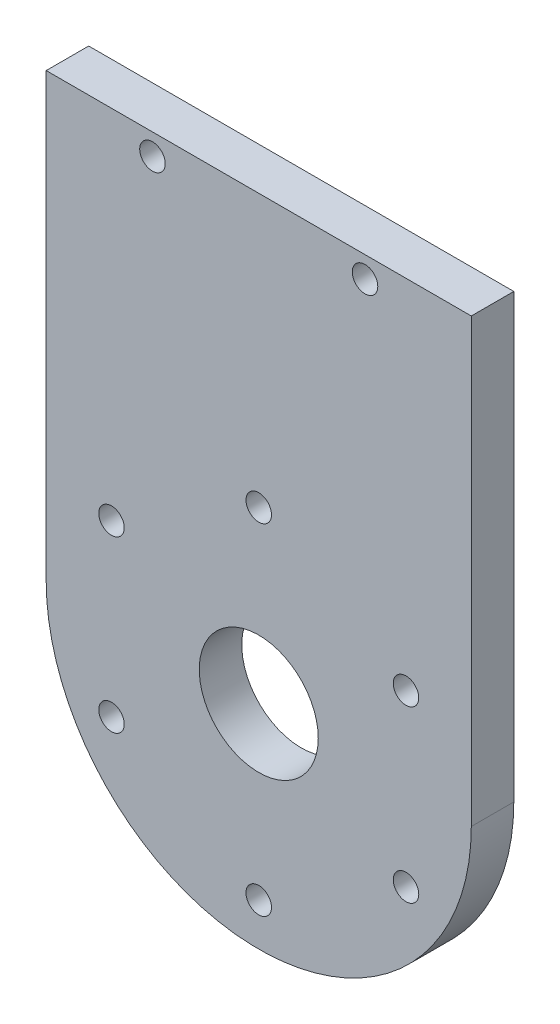
ISO-10303-21;
HEADER;
FILE_DESCRIPTION(('STEP AP214'),'2;1');
FILE_NAME('part.step','',(''),(''),'','','');
FILE_SCHEMA(('AUTOMOTIVE_DESIGN { 1 0 10303 214 1 1 1 1 }'));
ENDSEC;
DATA;
#1=APPLICATION_CONTEXT('core data for automotive mechanical design processes');
#2=APPLICATION_PROTOCOL_DEFINITION('international standard','automotive_design',2000,#1);
#3=PRODUCT_CONTEXT('',#1,'mechanical');
#4=PRODUCT('Part','Part','',(#3));
#5=PRODUCT_RELATED_PRODUCT_CATEGORY('part','',(#4));
#6=PRODUCT_DEFINITION_FORMATION('','',#4);
#7=PRODUCT_DEFINITION_CONTEXT('part definition',#1,'design');
#8=PRODUCT_DEFINITION('design','',#6,#7);
#9=PRODUCT_DEFINITION_SHAPE('','',#8);
#10=(LENGTH_UNIT() NAMED_UNIT(*) SI_UNIT(.MILLI.,.METRE.));
#11=(NAMED_UNIT(*) PLANE_ANGLE_UNIT() SI_UNIT($,.RADIAN.));
#12=(NAMED_UNIT(*) SI_UNIT($,.STERADIAN.) SOLID_ANGLE_UNIT());
#13=UNCERTAINTY_MEASURE_WITH_UNIT(LENGTH_MEASURE(1.E-05),#10,'distance_accuracy_value','');
#14=(GEOMETRIC_REPRESENTATION_CONTEXT(3) GLOBAL_UNCERTAINTY_ASSIGNED_CONTEXT((#13)) GLOBAL_UNIT_ASSIGNED_CONTEXT((#10,
#11,#12)) REPRESENTATION_CONTEXT('',''));
#15=CARTESIAN_POINT('',(0.,0.,0.));
#16=DIRECTION('',(0.,0.,1.));
#17=DIRECTION('',(1.,0.,0.));
#18=AXIS2_PLACEMENT_3D('',#15,#16,#17);
#19=CARTESIAN_POINT('',(0.,52.,5.));
#20=DIRECTION('',(0.,1.,0.));
#21=DIRECTION('',(0.,0.,1.));
#22=AXIS2_PLACEMENT_3D('',#19,#20,#21);
#23=PLANE('',#22);
#24=DIRECTION('',(1.,0.,0.));
#25=VECTOR('',#24,1.);
#26=CARTESIAN_POINT('',(0.,52.,5.));
#27=LINE('',#26,#25);
#28=CARTESIAN_POINT('',(-25.,52.,5.));
#29=VERTEX_POINT('',#28);
#30=CARTESIAN_POINT('',(25.,52.,5.));
#31=VERTEX_POINT('',#30);
#32=EDGE_CURVE('E12',#29,#31,#27,.T.);
#33=ORIENTED_EDGE('',*,*,#32,.T.);
#34=DIRECTION('',(0.,0.,1.));
#35=VECTOR('',#34,1.);
#36=CARTESIAN_POINT('',(25.,52.,0.));
#37=LINE('',#36,#35);
#38=CARTESIAN_POINT('',(25.,52.,0.));
#39=VERTEX_POINT('',#38);
#40=EDGE_CURVE('E341',#39,#31,#37,.T.);
#41=ORIENTED_EDGE('',*,*,#40,.F.);
#42=DIRECTION('',(1.,0.,0.));
#43=VECTOR('',#42,1.);
#44=CARTESIAN_POINT('',(0.,52.,0.));
#45=LINE('',#44,#43);
#46=CARTESIAN_POINT('',(-25.,52.,0.));
#47=VERTEX_POINT('',#46);
#48=EDGE_CURVE('E261',#47,#39,#45,.T.);
#49=ORIENTED_EDGE('',*,*,#48,.F.);
#50=DIRECTION('',(0.,0.,1.));
#51=VECTOR('',#50,1.);
#52=CARTESIAN_POINT('',(-25.,52.,0.));
#53=LINE('',#52,#51);
#54=EDGE_CURVE('E275',#47,#29,#53,.T.);
#55=ORIENTED_EDGE('',*,*,#54,.T.);
#56=EDGE_LOOP('',(#33,#41,#49,#55));
#57=FACE_BOUND('',#56,.T.);
#58=ADVANCED_FACE('F257',(#57),#23,.T.);
#59=CARTESIAN_POINT('',(0.,0.,5.));
#60=DIRECTION('',(0.,0.,1.));
#61=DIRECTION('',(1.,0.,0.));
#62=AXIS2_PLACEMENT_3D('',#59,#60,#61);
#63=PLANE('',#62);
#64=CARTESIAN_POINT('',(17.3205080756901,-9.99999999999926,5.));
#65=DIRECTION('',(0.,0.,1.));
#66=DIRECTION('',(1.,0.,0.));
#67=AXIS2_PLACEMENT_3D('',#64,#65,#66);
#68=CIRCLE('',#67,1.50000000000181);
#69=CARTESIAN_POINT('',(18.8205080756919,-9.99999999999926,5.));
#70=VERTEX_POINT('',#69);
#71=EDGE_CURVE('E423',#70,#70,#68,.T.);
#72=ORIENTED_EDGE('',*,*,#71,.F.);
#73=EDGE_LOOP('',(#72));
#74=FACE_BOUND('',#73,.T.);
#75=CARTESIAN_POINT('',(-17.3205080756884,9.99999999999925,5.));
#76=DIRECTION('',(0.,0.,1.));
#77=DIRECTION('',(1.,0.,0.));
#78=AXIS2_PLACEMENT_3D('',#75,#76,#77);
#79=CIRCLE('',#78,1.50000000000181);
#80=CARTESIAN_POINT('',(-15.8205080756865,9.99999999999925,5.));
#81=VERTEX_POINT('',#80);
#82=EDGE_CURVE('E452',#81,#81,#79,.T.);
#83=ORIENTED_EDGE('',*,*,#82,.F.);
#84=EDGE_LOOP('',(#83));
#85=FACE_BOUND('',#84,.T.);
#86=CARTESIAN_POINT('',(-17.3205080756875,-10.0000000000007,5.));
#87=DIRECTION('',(0.,0.,1.));
#88=DIRECTION('',(1.,0.,0.));
#89=AXIS2_PLACEMENT_3D('',#86,#87,#88);
#90=CIRCLE('',#89,1.50000000000181);
#91=CARTESIAN_POINT('',(-15.8205080756857,-10.0000000000007,5.));
#92=VERTEX_POINT('',#91);
#93=EDGE_CURVE('E327',#92,#92,#90,.T.);
#94=ORIENTED_EDGE('',*,*,#93,.F.);
#95=EDGE_LOOP('',(#94));
#96=FACE_BOUND('',#95,.T.);
#97=CARTESIAN_POINT('',(1.70040397862765E-12,-20.,5.));
#98=DIRECTION('',(0.,0.,1.));
#99=DIRECTION('',(1.,0.,0.));
#100=AXIS2_PLACEMENT_3D('',#97,#98,#99);
#101=CIRCLE('',#100,1.50000000000181);
#102=CARTESIAN_POINT('',(1.50000000000351,-20.,5.));
#103=VERTEX_POINT('',#102);
#104=EDGE_CURVE('E466',#103,#103,#101,.T.);
#105=ORIENTED_EDGE('',*,*,#104,.F.);
#106=EDGE_LOOP('',(#105));
#107=FACE_BOUND('',#106,.T.);
#108=CARTESIAN_POINT('',(0.,20.,5.));
#109=DIRECTION('',(0.,0.,1.));
#110=DIRECTION('',(1.,0.,0.));
#111=AXIS2_PLACEMENT_3D('',#108,#109,#110);
#112=CIRCLE('',#111,1.50000000000181);
#113=CARTESIAN_POINT('',(1.50000000000181,20.,5.));
#114=VERTEX_POINT('',#113);
#115=EDGE_CURVE('E416',#114,#114,#112,.T.);
#116=ORIENTED_EDGE('',*,*,#115,.F.);
#117=EDGE_LOOP('',(#116));
#118=FACE_BOUND('',#117,.T.);
#119=CARTESIAN_POINT('',(17.3205080756892,10.0000000000007,5.));
#120=DIRECTION('',(0.,0.,1.));
#121=DIRECTION('',(1.,0.,0.));
#122=AXIS2_PLACEMENT_3D('',#119,#120,#121);
#123=CIRCLE('',#122,1.50000000000181);
#124=CARTESIAN_POINT('',(18.820508075691,10.0000000000007,5.));
#125=VERTEX_POINT('',#124);
#126=EDGE_CURVE('E426',#125,#125,#123,.T.);
#127=ORIENTED_EDGE('',*,*,#126,.F.);
#128=EDGE_LOOP('',(#127));
#129=FACE_BOUND('',#128,.T.);
#130=CARTESIAN_POINT('',(-12.5,49.5,5.));
#131=DIRECTION('',(0.,0.,1.));
#132=DIRECTION('',(1.,0.,0.));
#133=AXIS2_PLACEMENT_3D('',#130,#131,#132);
#134=CIRCLE('',#133,1.5);
#135=CARTESIAN_POINT('',(-11.,49.5,5.));
#136=VERTEX_POINT('',#135);
#137=EDGE_CURVE('E436',#136,#136,#134,.T.);
#138=ORIENTED_EDGE('',*,*,#137,.F.);
#139=EDGE_LOOP('',(#138));
#140=FACE_BOUND('',#139,.T.);
#141=CARTESIAN_POINT('',(12.5,49.5,5.));
#142=DIRECTION('',(0.,0.,1.));
#143=DIRECTION('',(1.,0.,0.));
#144=AXIS2_PLACEMENT_3D('',#141,#142,#143);
#145=CIRCLE('',#144,1.5);
#146=CARTESIAN_POINT('',(14.,49.5,5.));
#147=VERTEX_POINT('',#146);
#148=EDGE_CURVE('E444',#147,#147,#145,.T.);
#149=ORIENTED_EDGE('',*,*,#148,.F.);
#150=EDGE_LOOP('',(#149));
#151=FACE_BOUND('',#150,.T.);
#152=CARTESIAN_POINT('',(0.,0.,5.));
#153=DIRECTION('',(0.,0.,1.));
#154=DIRECTION('',(1.,0.,0.));
#155=AXIS2_PLACEMENT_3D('',#152,#153,#154);
#156=CIRCLE('',#155,7.);
#157=CARTESIAN_POINT('',(7.,0.,5.));
#158=VERTEX_POINT('',#157);
#159=EDGE_CURVE('E267',#158,#158,#156,.T.);
#160=ORIENTED_EDGE('',*,*,#159,.F.);
#161=EDGE_LOOP('',(#160));
#162=FACE_BOUND('',#161,.T.);
#163=CARTESIAN_POINT('',(0.,0.,5.));
#164=DIRECTION('',(0.,0.,1.));
#165=DIRECTION('',(1.,0.,0.));
#166=AXIS2_PLACEMENT_3D('',#163,#164,#165);
#167=CIRCLE('',#166,25.);
#168=CARTESIAN_POINT('',(-25.,0.,5.));
#169=VERTEX_POINT('',#168);
#170=CARTESIAN_POINT('',(25.,0.,5.));
#171=VERTEX_POINT('',#170);
#172=EDGE_CURVE('E307',#169,#171,#167,.T.);
#173=ORIENTED_EDGE('',*,*,#172,.T.);
#174=DIRECTION('',(0.,1.,0.));
#175=VECTOR('',#174,1.);
#176=CARTESIAN_POINT('',(25.,0.,5.));
#177=LINE('',#176,#175);
#178=EDGE_CURVE('E302',#171,#31,#177,.T.);
#179=ORIENTED_EDGE('',*,*,#178,.T.);
#180=ORIENTED_EDGE('',*,*,#32,.F.);
#181=DIRECTION('',(0.,1.,0.));
#182=VECTOR('',#181,1.);
#183=CARTESIAN_POINT('',(-25.,0.,5.));
#184=LINE('',#183,#182);
#185=EDGE_CURVE('E324',#169,#29,#184,.T.);
#186=ORIENTED_EDGE('',*,*,#185,.F.);
#187=EDGE_LOOP('',(#173,#179,#180,#186));
#188=FACE_BOUND('',#187,.T.);
#189=ADVANCED_FACE('F358',(#74,#85,#96,#107,#118,#129,#140,#151,#162,#188),#63,.T.);
#190=CARTESIAN_POINT('',(0.,0.,0.));
#191=DIRECTION('',(0.,0.,1.));
#192=DIRECTION('',(1.,0.,0.));
#193=AXIS2_PLACEMENT_3D('',#190,#191,#192);
#194=PLANE('',#193);
#195=CARTESIAN_POINT('',(17.3205080756901,-9.99999999999926,0.));
#196=DIRECTION('',(0.,0.,1.));
#197=DIRECTION('',(1.,0.,0.));
#198=AXIS2_PLACEMENT_3D('',#195,#196,#197);
#199=CIRCLE('',#198,1.50000000000181);
#200=CARTESIAN_POINT('',(18.8205080756919,-9.99999999999926,0.));
#201=VERTEX_POINT('',#200);
#202=EDGE_CURVE('E456',#201,#201,#199,.T.);
#203=ORIENTED_EDGE('',*,*,#202,.T.);
#204=EDGE_LOOP('',(#203));
#205=FACE_BOUND('',#204,.T.);
#206=CARTESIAN_POINT('',(-17.3205080756884,9.99999999999925,0.));
#207=DIRECTION('',(0.,0.,1.));
#208=DIRECTION('',(1.,0.,0.));
#209=AXIS2_PLACEMENT_3D('',#206,#207,#208);
#210=CIRCLE('',#209,1.50000000000181);
#211=CARTESIAN_POINT('',(-15.8205080756865,9.99999999999925,0.));
#212=VERTEX_POINT('',#211);
#213=EDGE_CURVE('E448',#212,#212,#210,.T.);
#214=ORIENTED_EDGE('',*,*,#213,.T.);
#215=EDGE_LOOP('',(#214));
#216=FACE_BOUND('',#215,.T.);
#217=CARTESIAN_POINT('',(-17.3205080756875,-10.0000000000007,0.));
#218=DIRECTION('',(0.,0.,1.));
#219=DIRECTION('',(1.,0.,0.));
#220=AXIS2_PLACEMENT_3D('',#217,#218,#219);
#221=CIRCLE('',#220,1.50000000000181);
#222=CARTESIAN_POINT('',(-15.8205080756857,-10.0000000000007,0.));
#223=VERTEX_POINT('',#222);
#224=EDGE_CURVE('E469',#223,#223,#221,.T.);
#225=ORIENTED_EDGE('',*,*,#224,.T.);
#226=EDGE_LOOP('',(#225));
#227=FACE_BOUND('',#226,.T.);
#228=CARTESIAN_POINT('',(1.70040397862765E-12,-20.,0.));
#229=DIRECTION('',(0.,0.,1.));
#230=DIRECTION('',(1.,0.,0.));
#231=AXIS2_PLACEMENT_3D('',#228,#229,#230);
#232=CIRCLE('',#231,1.50000000000181);
#233=CARTESIAN_POINT('',(1.50000000000351,-20.,0.));
#234=VERTEX_POINT('',#233);
#235=EDGE_CURVE('E334',#234,#234,#232,.T.);
#236=ORIENTED_EDGE('',*,*,#235,.T.);
#237=EDGE_LOOP('',(#236));
#238=FACE_BOUND('',#237,.T.);
#239=CARTESIAN_POINT('',(0.,20.,0.));
#240=DIRECTION('',(0.,0.,1.));
#241=DIRECTION('',(1.,0.,0.));
#242=AXIS2_PLACEMENT_3D('',#239,#240,#241);
#243=CIRCLE('',#242,1.50000000000181);
#244=CARTESIAN_POINT('',(1.50000000000181,20.,0.));
#245=VERTEX_POINT('',#244);
#246=EDGE_CURVE('E413',#245,#245,#243,.T.);
#247=ORIENTED_EDGE('',*,*,#246,.T.);
#248=EDGE_LOOP('',(#247));
#249=FACE_BOUND('',#248,.T.);
#250=CARTESIAN_POINT('',(17.3205080756892,10.0000000000007,0.));
#251=DIRECTION('',(0.,0.,1.));
#252=DIRECTION('',(1.,0.,0.));
#253=AXIS2_PLACEMENT_3D('',#250,#251,#252);
#254=CIRCLE('',#253,1.50000000000181);
#255=CARTESIAN_POINT('',(18.820508075691,10.0000000000007,0.));
#256=VERTEX_POINT('',#255);
#257=EDGE_CURVE('E419',#256,#256,#254,.T.);
#258=ORIENTED_EDGE('',*,*,#257,.T.);
#259=EDGE_LOOP('',(#258));
#260=FACE_BOUND('',#259,.T.);
#261=CARTESIAN_POINT('',(-12.5,49.5,0.));
#262=DIRECTION('',(0.,0.,1.));
#263=DIRECTION('',(1.,0.,0.));
#264=AXIS2_PLACEMENT_3D('',#261,#262,#263);
#265=CIRCLE('',#264,1.5);
#266=CARTESIAN_POINT('',(-11.,49.5,0.));
#267=VERTEX_POINT('',#266);
#268=EDGE_CURVE('E432',#267,#267,#265,.T.);
#269=ORIENTED_EDGE('',*,*,#268,.T.);
#270=EDGE_LOOP('',(#269));
#271=FACE_BOUND('',#270,.T.);
#272=CARTESIAN_POINT('',(12.5,49.5,0.));
#273=DIRECTION('',(0.,0.,1.));
#274=DIRECTION('',(1.,0.,0.));
#275=AXIS2_PLACEMENT_3D('',#272,#273,#274);
#276=CIRCLE('',#275,1.5);
#277=CARTESIAN_POINT('',(14.,49.5,0.));
#278=VERTEX_POINT('',#277);
#279=EDGE_CURVE('E440',#278,#278,#276,.T.);
#280=ORIENTED_EDGE('',*,*,#279,.T.);
#281=EDGE_LOOP('',(#280));
#282=FACE_BOUND('',#281,.T.);
#283=CARTESIAN_POINT('',(0.,0.,0.));
#284=DIRECTION('',(0.,0.,1.));
#285=DIRECTION('',(1.,0.,0.));
#286=AXIS2_PLACEMENT_3D('',#283,#284,#285);
#287=CIRCLE('',#286,7.);
#288=CARTESIAN_POINT('',(7.,0.,0.));
#289=VERTEX_POINT('',#288);
#290=EDGE_CURVE('E340',#289,#289,#287,.T.);
#291=ORIENTED_EDGE('',*,*,#290,.T.);
#292=EDGE_LOOP('',(#291));
#293=FACE_BOUND('',#292,.T.);
#294=DIRECTION('',(0.,1.,0.));
#295=VECTOR('',#294,1.);
#296=CARTESIAN_POINT('',(25.,0.,0.));
#297=LINE('',#296,#295);
#298=CARTESIAN_POINT('',(25.,0.,0.));
#299=VERTEX_POINT('',#298);
#300=EDGE_CURVE('E310',#299,#39,#297,.T.);
#301=ORIENTED_EDGE('',*,*,#300,.F.);
#302=CARTESIAN_POINT('',(0.,0.,0.));
#303=DIRECTION('',(0.,0.,1.));
#304=DIRECTION('',(1.,0.,0.));
#305=AXIS2_PLACEMENT_3D('',#302,#303,#304);
#306=CIRCLE('',#305,25.);
#307=CARTESIAN_POINT('',(-25.,0.,0.));
#308=VERTEX_POINT('',#307);
#309=EDGE_CURVE('E284',#308,#299,#306,.T.);
#310=ORIENTED_EDGE('',*,*,#309,.F.);
#311=DIRECTION('',(0.,1.,0.));
#312=VECTOR('',#311,1.);
#313=CARTESIAN_POINT('',(-25.,0.,0.));
#314=LINE('',#313,#312);
#315=EDGE_CURVE('E312',#308,#47,#314,.T.);
#316=ORIENTED_EDGE('',*,*,#315,.T.);
#317=ORIENTED_EDGE('',*,*,#48,.T.);
#318=EDGE_LOOP('',(#301,#310,#316,#317));
#319=FACE_BOUND('',#318,.T.);
#320=ADVANCED_FACE('F320',(#205,#216,#227,#238,#249,#260,#271,#282,#293,#319),#194,.F.);
#321=CARTESIAN_POINT('',(0.,0.,5.));
#322=DIRECTION('',(0.,0.,-1.));
#323=DIRECTION('',(-1.,0.,0.));
#324=AXIS2_PLACEMENT_3D('',#321,#322,#323);
#325=CYLINDRICAL_SURFACE('',#324,7.);
#326=ORIENTED_EDGE('',*,*,#159,.T.);
#327=EDGE_LOOP('',(#326));
#328=FACE_BOUND('',#327,.T.);
#329=ORIENTED_EDGE('',*,*,#290,.F.);
#330=EDGE_LOOP('',(#329));
#331=FACE_BOUND('',#330,.T.);
#332=ADVANCED_FACE('F259',(#328,#331),#325,.F.);
#333=CARTESIAN_POINT('',(0.,0.,0.));
#334=DIRECTION('',(0.,0.,1.));
#335=DIRECTION('',(1.,0.,0.));
#336=AXIS2_PLACEMENT_3D('',#333,#334,#335);
#337=CYLINDRICAL_SURFACE('',#336,25.);
#338=ORIENTED_EDGE('',*,*,#172,.F.);
#339=DIRECTION('',(0.,0.,1.));
#340=VECTOR('',#339,1.);
#341=CARTESIAN_POINT('',(-25.,0.,0.));
#342=LINE('',#341,#340);
#343=EDGE_CURVE('E304',#308,#169,#342,.T.);
#344=ORIENTED_EDGE('',*,*,#343,.F.);
#345=ORIENTED_EDGE('',*,*,#309,.T.);
#346=DIRECTION('',(0.,0.,1.));
#347=VECTOR('',#346,1.);
#348=CARTESIAN_POINT('',(25.,0.,0.));
#349=LINE('',#348,#347);
#350=EDGE_CURVE('E337',#299,#171,#349,.T.);
#351=ORIENTED_EDGE('',*,*,#350,.T.);
#352=EDGE_LOOP('',(#338,#344,#345,#351));
#353=FACE_BOUND('',#352,.T.);
#354=ADVANCED_FACE('F305',(#353),#337,.T.);
#355=CARTESIAN_POINT('',(25.,0.,0.));
#356=DIRECTION('',(1.,0.,0.));
#357=DIRECTION('',(0.,1.,0.));
#358=AXIS2_PLACEMENT_3D('',#355,#356,#357);
#359=PLANE('',#358);
#360=ORIENTED_EDGE('',*,*,#178,.F.);
#361=ORIENTED_EDGE('',*,*,#350,.F.);
#362=ORIENTED_EDGE('',*,*,#300,.T.);
#363=ORIENTED_EDGE('',*,*,#40,.T.);
#364=EDGE_LOOP('',(#360,#361,#362,#363));
#365=FACE_BOUND('',#364,.T.);
#366=ADVANCED_FACE('F356',(#365),#359,.T.);
#367=CARTESIAN_POINT('',(-25.,0.,0.));
#368=DIRECTION('',(1.,0.,0.));
#369=DIRECTION('',(0.,1.,0.));
#370=AXIS2_PLACEMENT_3D('',#367,#368,#369);
#371=PLANE('',#370);
#372=ORIENTED_EDGE('',*,*,#185,.T.);
#373=ORIENTED_EDGE('',*,*,#54,.F.);
#374=ORIENTED_EDGE('',*,*,#315,.F.);
#375=ORIENTED_EDGE('',*,*,#343,.T.);
#376=EDGE_LOOP('',(#372,#373,#374,#375));
#377=FACE_BOUND('',#376,.T.);
#378=ADVANCED_FACE('F313',(#377),#371,.F.);
#379=CARTESIAN_POINT('',(12.5,49.5,0.));
#380=DIRECTION('',(0.,0.,1.));
#381=DIRECTION('',(1.,0.,0.));
#382=AXIS2_PLACEMENT_3D('',#379,#380,#381);
#383=CYLINDRICAL_SURFACE('',#382,1.5);
#384=ORIENTED_EDGE('',*,*,#279,.F.);
#385=EDGE_LOOP('',(#384));
#386=FACE_BOUND('',#385,.T.);
#387=ORIENTED_EDGE('',*,*,#148,.T.);
#388=EDGE_LOOP('',(#387));
#389=FACE_BOUND('',#388,.T.);
#390=ADVANCED_FACE('F375',(#386,#389),#383,.F.);
#391=CARTESIAN_POINT('',(-12.5,49.5,0.));
#392=DIRECTION('',(0.,0.,1.));
#393=DIRECTION('',(1.,0.,0.));
#394=AXIS2_PLACEMENT_3D('',#391,#392,#393);
#395=CYLINDRICAL_SURFACE('',#394,1.5);
#396=ORIENTED_EDGE('',*,*,#268,.F.);
#397=EDGE_LOOP('',(#396));
#398=FACE_BOUND('',#397,.T.);
#399=ORIENTED_EDGE('',*,*,#137,.T.);
#400=EDGE_LOOP('',(#399));
#401=FACE_BOUND('',#400,.T.);
#402=ADVANCED_FACE('F397',(#398,#401),#395,.F.);
#403=CARTESIAN_POINT('',(17.3205080756892,10.0000000000007,0.));
#404=DIRECTION('',(0.,0.,1.));
#405=DIRECTION('',(1.,0.,0.));
#406=AXIS2_PLACEMENT_3D('',#403,#404,#405);
#407=CYLINDRICAL_SURFACE('',#406,1.50000000000181);
#408=ORIENTED_EDGE('',*,*,#257,.F.);
#409=EDGE_LOOP('',(#408));
#410=FACE_BOUND('',#409,.T.);
#411=ORIENTED_EDGE('',*,*,#126,.T.);
#412=EDGE_LOOP('',(#411));
#413=FACE_BOUND('',#412,.T.);
#414=ADVANCED_FACE('F401',(#410,#413),#407,.F.);
#415=CARTESIAN_POINT('',(0.,20.,0.));
#416=DIRECTION('',(0.,0.,1.));
#417=DIRECTION('',(1.,0.,0.));
#418=AXIS2_PLACEMENT_3D('',#415,#416,#417);
#419=CYLINDRICAL_SURFACE('',#418,1.50000000000181);
#420=ORIENTED_EDGE('',*,*,#246,.F.);
#421=EDGE_LOOP('',(#420));
#422=FACE_BOUND('',#421,.T.);
#423=ORIENTED_EDGE('',*,*,#115,.T.);
#424=EDGE_LOOP('',(#423));
#425=FACE_BOUND('',#424,.T.);
#426=ADVANCED_FACE('F386',(#422,#425),#419,.F.);
#427=CARTESIAN_POINT('',(1.70040397862765E-12,-20.,0.));
#428=DIRECTION('',(0.,0.,1.));
#429=DIRECTION('',(1.,0.,0.));
#430=AXIS2_PLACEMENT_3D('',#427,#428,#429);
#431=CYLINDRICAL_SURFACE('',#430,1.50000000000181);
#432=ORIENTED_EDGE('',*,*,#235,.F.);
#433=EDGE_LOOP('',(#432));
#434=FACE_BOUND('',#433,.T.);
#435=ORIENTED_EDGE('',*,*,#104,.T.);
#436=EDGE_LOOP('',(#435));
#437=FACE_BOUND('',#436,.T.);
#438=ADVANCED_FACE('F382',(#434,#437),#431,.F.);
#439=CARTESIAN_POINT('',(-17.3205080756875,-10.0000000000007,0.));
#440=DIRECTION('',(0.,0.,1.));
#441=DIRECTION('',(1.,0.,0.));
#442=AXIS2_PLACEMENT_3D('',#439,#440,#441);
#443=CYLINDRICAL_SURFACE('',#442,1.50000000000181);
#444=ORIENTED_EDGE('',*,*,#224,.F.);
#445=EDGE_LOOP('',(#444));
#446=FACE_BOUND('',#445,.T.);
#447=ORIENTED_EDGE('',*,*,#93,.T.);
#448=EDGE_LOOP('',(#447));
#449=FACE_BOUND('',#448,.T.);
#450=ADVANCED_FACE('F378',(#446,#449),#443,.F.);
#451=CARTESIAN_POINT('',(-17.3205080756884,9.99999999999925,0.));
#452=DIRECTION('',(0.,0.,1.));
#453=DIRECTION('',(1.,0.,0.));
#454=AXIS2_PLACEMENT_3D('',#451,#452,#453);
#455=CYLINDRICAL_SURFACE('',#454,1.50000000000181);
#456=ORIENTED_EDGE('',*,*,#213,.F.);
#457=EDGE_LOOP('',(#456));
#458=FACE_BOUND('',#457,.T.);
#459=ORIENTED_EDGE('',*,*,#82,.T.);
#460=EDGE_LOOP('',(#459));
#461=FACE_BOUND('',#460,.T.);
#462=ADVANCED_FACE('F381',(#458,#461),#455,.F.);
#463=CARTESIAN_POINT('',(17.3205080756901,-9.99999999999926,0.));
#464=DIRECTION('',(0.,0.,1.));
#465=DIRECTION('',(1.,0.,0.));
#466=AXIS2_PLACEMENT_3D('',#463,#464,#465);
#467=CYLINDRICAL_SURFACE('',#466,1.50000000000181);
#468=ORIENTED_EDGE('',*,*,#202,.F.);
#469=EDGE_LOOP('',(#468));
#470=FACE_BOUND('',#469,.T.);
#471=ORIENTED_EDGE('',*,*,#71,.T.);
#472=EDGE_LOOP('',(#471));
#473=FACE_BOUND('',#472,.T.);
#474=ADVANCED_FACE('F388',(#470,#473),#467,.F.);
#475=CLOSED_SHELL('',(#58,#189,#320,#332,#354,#366,#378,#390,#402,#414,#426,#438,#450,#462,#474));
#476=MANIFOLD_SOLID_BREP('B2',#475);
#477=ADVANCED_BREP_SHAPE_REPRESENTATION('',(#18,#476),#14);
#478=SHAPE_DEFINITION_REPRESENTATION(#9,#477);
ENDSEC;
END-ISO-10303-21;
